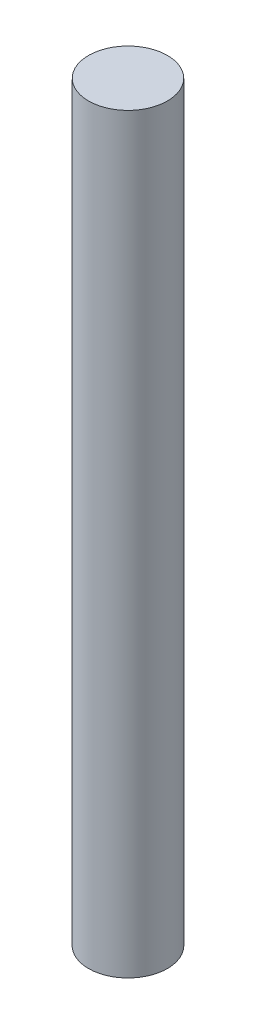
ISO-10303-21;
HEADER;
FILE_DESCRIPTION(('STEP AP214'),'2;1');
FILE_NAME('part.step','',(''),(''),'','','');
FILE_SCHEMA(('AUTOMOTIVE_DESIGN { 1 0 10303 214 1 1 1 1 }'));
ENDSEC;
DATA;
#1=APPLICATION_CONTEXT('core data for automotive mechanical design processes');
#2=APPLICATION_PROTOCOL_DEFINITION('international standard','automotive_design',2000,#1);
#3=PRODUCT_CONTEXT('',#1,'mechanical');
#4=PRODUCT('Part','Part','',(#3));
#5=PRODUCT_RELATED_PRODUCT_CATEGORY('part','',(#4));
#6=PRODUCT_DEFINITION_FORMATION('','',#4);
#7=PRODUCT_DEFINITION_CONTEXT('part definition',#1,'design');
#8=PRODUCT_DEFINITION('design','',#6,#7);
#9=PRODUCT_DEFINITION_SHAPE('','',#8);
#10=(LENGTH_UNIT() NAMED_UNIT(*) SI_UNIT(.MILLI.,.METRE.));
#11=(NAMED_UNIT(*) PLANE_ANGLE_UNIT() SI_UNIT($,.RADIAN.));
#12=(NAMED_UNIT(*) SI_UNIT($,.STERADIAN.) SOLID_ANGLE_UNIT());
#13=UNCERTAINTY_MEASURE_WITH_UNIT(LENGTH_MEASURE(1.E-05),#10,'distance_accuracy_value','');
#14=(GEOMETRIC_REPRESENTATION_CONTEXT(3) GLOBAL_UNCERTAINTY_ASSIGNED_CONTEXT((#13)) GLOBAL_UNIT_ASSIGNED_CONTEXT((#10,
#11,#12)) REPRESENTATION_CONTEXT('',''));
#15=CARTESIAN_POINT('',(0.,0.,0.));
#16=DIRECTION('',(0.,0.,1.));
#17=DIRECTION('',(1.,0.,0.));
#18=AXIS2_PLACEMENT_3D('',#15,#16,#17);
#19=CARTESIAN_POINT('',(0.,20.,0.));
#20=DIRECTION('',(0.,-1.,0.));
#21=DIRECTION('',(0.,0.,-1.));
#22=AXIS2_PLACEMENT_3D('',#19,#20,#21);
#23=CYLINDRICAL_SURFACE('',#22,1.05);
#24=CARTESIAN_POINT('',(0.,20.,0.));
#25=DIRECTION('',(0.,1.,0.));
#26=DIRECTION('',(0.,0.,1.));
#27=AXIS2_PLACEMENT_3D('',#24,#25,#26);
#28=CIRCLE('',#27,1.05);
#29=CARTESIAN_POINT('',(0.,20.,1.05));
#30=VERTEX_POINT('',#29);
#31=EDGE_CURVE('E10',#30,#30,#28,.T.);
#32=ORIENTED_EDGE('',*,*,#31,.F.);
#33=EDGE_LOOP('',(#32));
#34=FACE_BOUND('',#33,.T.);
#35=CARTESIAN_POINT('',(0.,0.,0.));
#36=DIRECTION('',(0.,1.,0.));
#37=DIRECTION('',(0.,0.,1.));
#38=AXIS2_PLACEMENT_3D('',#35,#36,#37);
#39=CIRCLE('',#38,1.05);
#40=CARTESIAN_POINT('',(0.,0.,1.05));
#41=VERTEX_POINT('',#40);
#42=EDGE_CURVE('E40',#41,#41,#39,.T.);
#43=ORIENTED_EDGE('',*,*,#42,.T.);
#44=EDGE_LOOP('',(#43));
#45=FACE_BOUND('',#44,.T.);
#46=ADVANCED_FACE('F37',(#34,#45),#23,.T.);
#47=CARTESIAN_POINT('',(0.,20.,0.));
#48=DIRECTION('',(0.,1.,0.));
#49=DIRECTION('',(0.,0.,1.));
#50=AXIS2_PLACEMENT_3D('',#47,#48,#49);
#51=PLANE('',#50);
#52=ORIENTED_EDGE('',*,*,#31,.T.);
#53=EDGE_LOOP('',(#52));
#54=FACE_BOUND('',#53,.T.);
#55=ADVANCED_FACE('F52',(#54),#51,.T.);
#56=CARTESIAN_POINT('',(0.,0.,0.));
#57=DIRECTION('',(0.,1.,0.));
#58=DIRECTION('',(0.,0.,1.));
#59=AXIS2_PLACEMENT_3D('',#56,#57,#58);
#60=PLANE('',#59);
#61=ORIENTED_EDGE('',*,*,#42,.F.);
#62=EDGE_LOOP('',(#61));
#63=FACE_BOUND('',#62,.T.);
#64=ADVANCED_FACE('F50',(#63),#60,.F.);
#65=CLOSED_SHELL('',(#46,#55,#64));
#66=MANIFOLD_SOLID_BREP('B2',#65);
#67=ADVANCED_BREP_SHAPE_REPRESENTATION('',(#18,#66),#14);
#68=SHAPE_DEFINITION_REPRESENTATION(#9,#67);
ENDSEC;
END-ISO-10303-21;
